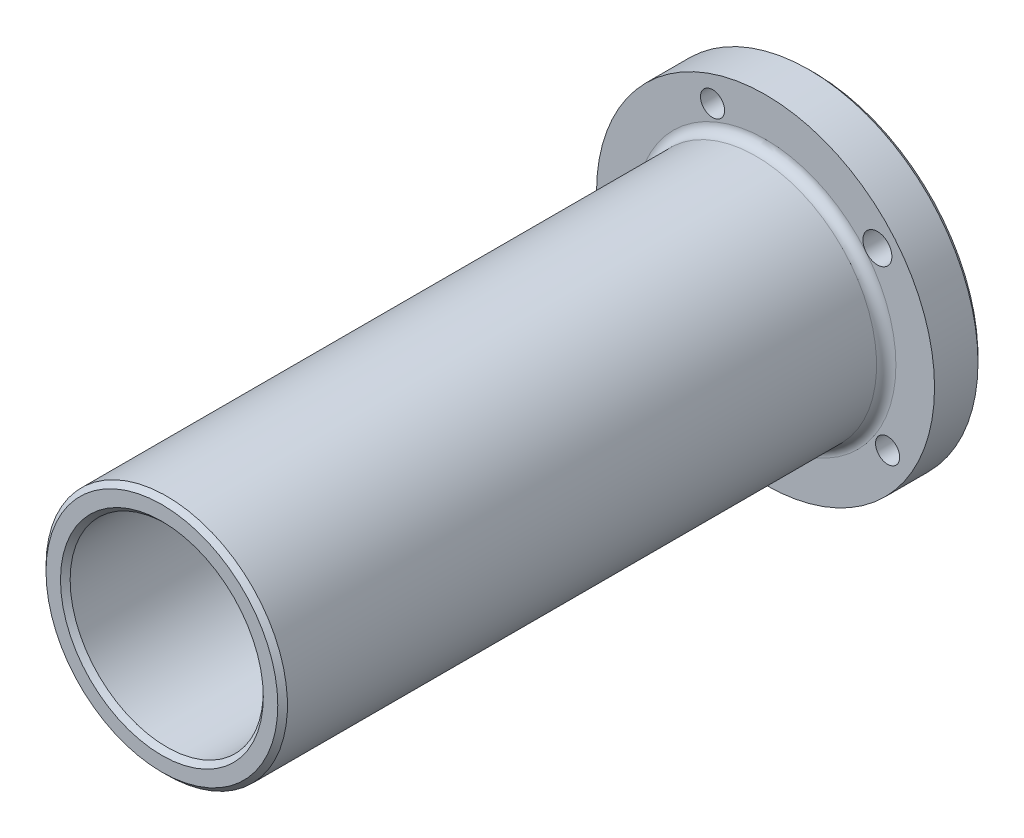
ISO-10303-21;
HEADER;
FILE_DESCRIPTION(('STEP AP214'),'2;1');
FILE_NAME('part.step','',(''),(''),'','','');
FILE_SCHEMA(('AUTOMOTIVE_DESIGN { 1 0 10303 214 1 1 1 1 }'));
ENDSEC;
DATA;
#1=APPLICATION_CONTEXT('core data for automotive mechanical design processes');
#2=APPLICATION_PROTOCOL_DEFINITION('international standard','automotive_design',2000,#1);
#3=PRODUCT_CONTEXT('',#1,'mechanical');
#4=PRODUCT('Part','Part','',(#3));
#5=PRODUCT_RELATED_PRODUCT_CATEGORY('part','',(#4));
#6=PRODUCT_DEFINITION_FORMATION('','',#4);
#7=PRODUCT_DEFINITION_CONTEXT('part definition',#1,'design');
#8=PRODUCT_DEFINITION('design','',#6,#7);
#9=PRODUCT_DEFINITION_SHAPE('','',#8);
#10=(LENGTH_UNIT() NAMED_UNIT(*) SI_UNIT(.MILLI.,.METRE.));
#11=(NAMED_UNIT(*) PLANE_ANGLE_UNIT() SI_UNIT($,.RADIAN.));
#12=(NAMED_UNIT(*) SI_UNIT($,.STERADIAN.) SOLID_ANGLE_UNIT());
#13=UNCERTAINTY_MEASURE_WITH_UNIT(LENGTH_MEASURE(1.E-05),#10,'distance_accuracy_value','');
#14=(GEOMETRIC_REPRESENTATION_CONTEXT(3) GLOBAL_UNCERTAINTY_ASSIGNED_CONTEXT((#13)) GLOBAL_UNIT_ASSIGNED_CONTEXT((#10,
#11,#12)) REPRESENTATION_CONTEXT('',''));
#15=CARTESIAN_POINT('',(0.,0.,0.));
#16=DIRECTION('',(0.,0.,1.));
#17=DIRECTION('',(1.,0.,0.));
#18=AXIS2_PLACEMENT_3D('',#15,#16,#17);
#19=CARTESIAN_POINT('',(70.,-1.10960886911009E-13,-135.));
#20=DIRECTION('',(0.,0.,1.));
#21=DIRECTION('',(1.,0.,0.));
#22=AXIS2_PLACEMENT_3D('',#19,#20,#21);
#23=CYLINDRICAL_SURFACE('',#22,25.);
#24=CARTESIAN_POINT('',(70.,-1.10960886911009E-13,-123.));
#25=DIRECTION('',(0.,0.,-1.));
#26=DIRECTION('',(-1.,0.,0.));
#27=AXIS2_PLACEMENT_3D('',#24,#25,#26);
#28=CIRCLE('',#27,25.);
#29=CARTESIAN_POINT('',(44.9999999999999,-1.10960886911009E-13,-123.));
#30=VERTEX_POINT('',#29);
#31=EDGE_CURVE('E50',#30,#30,#28,.F.);
#32=ORIENTED_EDGE('',*,*,#31,.T.);
#33=EDGE_LOOP('',(#32));
#34=FACE_BOUND('',#33,.T.);
#35=CARTESIAN_POINT('',(70.,-1.10960886911009E-13,-0.999999999999973));
#36=DIRECTION('',(0.,0.,-1.));
#37=DIRECTION('',(-1.,0.,0.));
#38=AXIS2_PLACEMENT_3D('',#35,#36,#37);
#39=CIRCLE('',#38,25.);
#40=CARTESIAN_POINT('',(44.9999999999999,-1.10960886911009E-13,-0.999999999999973));
#41=VERTEX_POINT('',#40);
#42=EDGE_CURVE('E85',#41,#41,#39,.T.);
#43=ORIENTED_EDGE('',*,*,#42,.T.);
#44=EDGE_LOOP('',(#43));
#45=FACE_BOUND('',#44,.T.);
#46=ADVANCED_FACE('F35',(#34,#45),#23,.T.);
#47=CARTESIAN_POINT('',(70.,-1.10960886911009E-13,0.));
#48=DIRECTION('',(0.,0.,-1.));
#49=DIRECTION('',(-1.,0.,0.));
#50=AXIS2_PLACEMENT_3D('',#47,#48,#49);
#51=PLANE('',#50);
#52=CARTESIAN_POINT('',(70.,-1.10960886911009E-13,0.));
#53=DIRECTION('',(0.,0.,-1.));
#54=DIRECTION('',(-1.,0.,0.));
#55=AXIS2_PLACEMENT_3D('',#52,#53,#54);
#56=CIRCLE('',#55,21.);
#57=CARTESIAN_POINT('',(48.9999999999999,-1.10960886911009E-13,0.));
#58=VERTEX_POINT('',#57);
#59=EDGE_CURVE('E54',#58,#58,#56,.T.);
#60=ORIENTED_EDGE('',*,*,#59,.T.);
#61=EDGE_LOOP('',(#60));
#62=FACE_BOUND('',#61,.T.);
#63=CARTESIAN_POINT('',(70.,-1.10960886911009E-13,0.));
#64=DIRECTION('',(0.,0.,-1.));
#65=DIRECTION('',(-1.,0.,0.));
#66=AXIS2_PLACEMENT_3D('',#63,#64,#65);
#67=CIRCLE('',#66,24.);
#68=CARTESIAN_POINT('',(45.9999999999999,-1.10960886911009E-13,0.));
#69=VERTEX_POINT('',#68);
#70=EDGE_CURVE('E83',#69,#69,#67,.F.);
#71=ORIENTED_EDGE('',*,*,#70,.T.);
#72=EDGE_LOOP('',(#71));
#73=FACE_BOUND('',#72,.T.);
#74=ADVANCED_FACE('F76',(#62,#73),#51,.F.);
#75=CARTESIAN_POINT('',(70.,-1.10960886911009E-13,-125.));
#76=DIRECTION('',(0.,0.,-1.));
#77=DIRECTION('',(-1.,0.,0.));
#78=AXIS2_PLACEMENT_3D('',#75,#76,#77);
#79=PLANE('',#78);
#80=CARTESIAN_POINT('',(93.168703387193,19.0581002032276,-125.));
#81=DIRECTION('',(0.,0.,-1.));
#82=DIRECTION('',(-1.,0.,0.));
#83=AXIS2_PLACEMENT_3D('',#80,#81,#82);
#84=CIRCLE('',#83,3.);
#85=CARTESIAN_POINT('',(90.8518330484737,17.1522901829048,-125.));
#86=VERTEX_POINT('',#85);
#87=EDGE_CURVE('E124',#86,#86,#84,.T.);
#88=ORIENTED_EDGE('',*,*,#87,.T.);
#89=CARTESIAN_POINT('',(70.,-1.10960886911009E-13,-125.));
#90=DIRECTION('',(0.,0.,-1.));
#91=DIRECTION('',(-1.,0.,0.));
#92=AXIS2_PLACEMENT_3D('',#89,#90,#91);
#93=CIRCLE('',#92,27.);
#94=EDGE_CURVE('E46',#86,#86,#93,.T.);
#95=ORIENTED_EDGE('',*,*,#94,.T.);
#96=EDGE_LOOP('',(#88,#95));
#97=FACE_BOUND('',#96,.T.);
#98=CARTESIAN_POINT('',(62.4581954582979,-29.0365491106429,-125.));
#99=DIRECTION('',(0.,0.,-1.));
#100=DIRECTION('',(-1.,0.,0.));
#101=AXIS2_PLACEMENT_3D('',#98,#99,#100);
#102=CIRCLE('',#101,2.5);
#103=CARTESIAN_POINT('',(59.9581954582979,-29.0365491106429,-125.));
#104=VERTEX_POINT('',#103);
#105=EDGE_CURVE('E118',#104,#104,#102,.T.);
#106=ORIENTED_EDGE('',*,*,#105,.T.);
#107=EDGE_LOOP('',(#106));
#108=FACE_BOUND('',#107,.T.);
#109=CARTESIAN_POINT('',(95.2848534707608,-16.1454694872017,-125.));
#110=DIRECTION('',(0.,0.,-1.));
#111=DIRECTION('',(-1.,0.,0.));
#112=AXIS2_PLACEMENT_3D('',#109,#110,#111);
#113=CIRCLE('',#112,2.5);
#114=CARTESIAN_POINT('',(92.7848534707608,-16.1454694872017,-125.));
#115=VERTEX_POINT('',#114);
#116=EDGE_CURVE('E112',#115,#115,#113,.T.);
#117=ORIENTED_EDGE('',*,*,#116,.T.);
#118=EDGE_LOOP('',(#117));
#119=FACE_BOUND('',#118,.T.);
#120=CARTESIAN_POINT('',(59.0341926977893,27.9240231737973,-125.));
#121=DIRECTION('',(0.,0.,-1.));
#122=DIRECTION('',(-1.,0.,0.));
#123=AXIS2_PLACEMENT_3D('',#120,#121,#122);
#124=CIRCLE('',#123,2.5);
#125=CARTESIAN_POINT('',(56.5341926977893,27.9240231737973,-125.));
#126=VERTEX_POINT('',#125);
#127=EDGE_CURVE('E106',#126,#126,#124,.T.);
#128=ORIENTED_EDGE('',*,*,#127,.T.);
#129=EDGE_LOOP('',(#128));
#130=FACE_BOUND('',#129,.T.);
#131=CARTESIAN_POINT('',(40.054054985959,-1.80010477918144,-125.));
#132=DIRECTION('',(0.,0.,-1.));
#133=DIRECTION('',(-1.,0.,0.));
#134=AXIS2_PLACEMENT_3D('',#131,#132,#133);
#135=CIRCLE('',#134,2.5);
#136=CARTESIAN_POINT('',(37.554054985959,-1.80010477918144,-125.));
#137=VERTEX_POINT('',#136);
#138=EDGE_CURVE('E100',#137,#137,#135,.T.);
#139=ORIENTED_EDGE('',*,*,#138,.T.);
#140=EDGE_LOOP('',(#139));
#141=FACE_BOUND('',#140,.T.);
#142=CARTESIAN_POINT('',(70.,-1.10960886911009E-13,-125.));
#143=DIRECTION('',(0.,0.,-1.));
#144=DIRECTION('',(-1.,0.,0.));
#145=AXIS2_PLACEMENT_3D('',#142,#143,#144);
#146=CIRCLE('',#145,35.);
#147=CARTESIAN_POINT('',(34.9999999999999,-1.10960886911009E-13,-125.));
#148=VERTEX_POINT('',#147);
#149=EDGE_CURVE('E97',#148,#148,#146,.T.);
#150=ORIENTED_EDGE('',*,*,#149,.F.);
#151=EDGE_LOOP('',(#150));
#152=FACE_BOUND('',#151,.T.);
#153=ADVANCED_FACE('F79',(#97,#108,#119,#130,#141,#152),#79,.F.);
#154=CARTESIAN_POINT('',(70.,-1.10960886911009E-13,-125.));
#155=DIRECTION('',(0.,0.,-1.));
#156=DIRECTION('',(-1.,0.,0.));
#157=AXIS2_PLACEMENT_3D('',#154,#155,#156);
#158=CYLINDRICAL_SURFACE('',#157,35.);
#159=CARTESIAN_POINT('',(70.,-1.10960886911009E-13,-134.));
#160=DIRECTION('',(0.,0.,-1.));
#161=DIRECTION('',(-1.,0.,0.));
#162=AXIS2_PLACEMENT_3D('',#159,#160,#161);
#163=CIRCLE('',#162,35.);
#164=CARTESIAN_POINT('',(34.9999999999999,-1.10960886911009E-13,-134.));
#165=VERTEX_POINT('',#164);
#166=EDGE_CURVE('E89',#165,#165,#163,.F.);
#167=ORIENTED_EDGE('',*,*,#166,.T.);
#168=EDGE_LOOP('',(#167));
#169=FACE_BOUND('',#168,.T.);
#170=ORIENTED_EDGE('',*,*,#149,.T.);
#171=EDGE_LOOP('',(#170));
#172=FACE_BOUND('',#171,.T.);
#173=ADVANCED_FACE('F194',(#169,#172),#158,.T.);
#174=CARTESIAN_POINT('',(70.,-1.10960886911009E-13,-135.));
#175=DIRECTION('',(0.,0.,-1.));
#176=DIRECTION('',(-1.,0.,0.));
#177=AXIS2_PLACEMENT_3D('',#174,#175,#176);
#178=PLANE('',#177);
#179=CARTESIAN_POINT('',(70.,-1.10960886911009E-13,-135.));
#180=DIRECTION('',(0.,0.,-1.));
#181=DIRECTION('',(-1.,0.,0.));
#182=AXIS2_PLACEMENT_3D('',#179,#180,#181);
#183=CIRCLE('',#182,21.);
#184=CARTESIAN_POINT('',(48.9999999999999,-1.10960886911009E-13,-135.));
#185=VERTEX_POINT('',#184);
#186=EDGE_CURVE('E11',#185,#185,#183,.F.);
#187=ORIENTED_EDGE('',*,*,#186,.T.);
#188=EDGE_LOOP('',(#187));
#189=FACE_BOUND('',#188,.T.);
#190=CARTESIAN_POINT('',(93.168703387193,19.0581002032276,-135.));
#191=DIRECTION('',(0.,0.,-1.));
#192=DIRECTION('',(-1.,0.,0.));
#193=AXIS2_PLACEMENT_3D('',#190,#191,#192);
#194=CIRCLE('',#193,3.50000000000003);
#195=CARTESIAN_POINT('',(89.6687033871929,19.0581002032276,-135.));
#196=VERTEX_POINT('',#195);
#197=EDGE_CURVE('E51',#196,#196,#194,.F.);
#198=ORIENTED_EDGE('',*,*,#197,.T.);
#199=EDGE_LOOP('',(#198));
#200=FACE_BOUND('',#199,.T.);
#201=CARTESIAN_POINT('',(62.4581954582979,-29.0365491106429,-135.));
#202=DIRECTION('',(0.,0.,-1.));
#203=DIRECTION('',(-1.,0.,0.));
#204=AXIS2_PLACEMENT_3D('',#201,#202,#203);
#205=CIRCLE('',#204,2.5);
#206=CARTESIAN_POINT('',(59.9581954582979,-29.0365491106429,-135.));
#207=VERTEX_POINT('',#206);
#208=EDGE_CURVE('E121',#207,#207,#205,.T.);
#209=ORIENTED_EDGE('',*,*,#208,.F.);
#210=EDGE_LOOP('',(#209));
#211=FACE_BOUND('',#210,.T.);
#212=CARTESIAN_POINT('',(95.2848534707608,-16.1454694872017,-135.));
#213=DIRECTION('',(0.,0.,-1.));
#214=DIRECTION('',(-1.,0.,0.));
#215=AXIS2_PLACEMENT_3D('',#212,#213,#214);
#216=CIRCLE('',#215,2.5);
#217=CARTESIAN_POINT('',(92.7848534707608,-16.1454694872017,-135.));
#218=VERTEX_POINT('',#217);
#219=EDGE_CURVE('E115',#218,#218,#216,.T.);
#220=ORIENTED_EDGE('',*,*,#219,.F.);
#221=EDGE_LOOP('',(#220));
#222=FACE_BOUND('',#221,.T.);
#223=CARTESIAN_POINT('',(59.0341926977893,27.9240231737973,-135.));
#224=DIRECTION('',(0.,0.,-1.));
#225=DIRECTION('',(-1.,0.,0.));
#226=AXIS2_PLACEMENT_3D('',#223,#224,#225);
#227=CIRCLE('',#226,2.5);
#228=CARTESIAN_POINT('',(56.5341926977893,27.9240231737973,-135.));
#229=VERTEX_POINT('',#228);
#230=EDGE_CURVE('E109',#229,#229,#227,.T.);
#231=ORIENTED_EDGE('',*,*,#230,.F.);
#232=EDGE_LOOP('',(#231));
#233=FACE_BOUND('',#232,.T.);
#234=CARTESIAN_POINT('',(40.054054985959,-1.80010477918144,-135.));
#235=DIRECTION('',(0.,0.,-1.));
#236=DIRECTION('',(-1.,0.,0.));
#237=AXIS2_PLACEMENT_3D('',#234,#235,#236);
#238=CIRCLE('',#237,2.5);
#239=CARTESIAN_POINT('',(37.554054985959,-1.80010477918144,-135.));
#240=VERTEX_POINT('',#239);
#241=EDGE_CURVE('E103',#240,#240,#238,.T.);
#242=ORIENTED_EDGE('',*,*,#241,.F.);
#243=EDGE_LOOP('',(#242));
#244=FACE_BOUND('',#243,.T.);
#245=CARTESIAN_POINT('',(70.,-1.10960886911009E-13,-135.));
#246=DIRECTION('',(0.,0.,-1.));
#247=DIRECTION('',(-1.,0.,0.));
#248=AXIS2_PLACEMENT_3D('',#245,#246,#247);
#249=CIRCLE('',#248,34.);
#250=CARTESIAN_POINT('',(36.,-1.10960886911009E-13,-135.));
#251=VERTEX_POINT('',#250);
#252=EDGE_CURVE('E94',#251,#251,#249,.T.);
#253=ORIENTED_EDGE('',*,*,#252,.T.);
#254=EDGE_LOOP('',(#253));
#255=FACE_BOUND('',#254,.T.);
#256=ADVANCED_FACE('F152',(#189,#200,#211,#222,#233,#244,#255),#178,.T.);
#257=CARTESIAN_POINT('',(70.,-1.10960886911009E-13,-135.));
#258=DIRECTION('',(0.,0.,1.));
#259=DIRECTION('',(1.,0.,0.));
#260=AXIS2_PLACEMENT_3D('',#257,#258,#259);
#261=CONICAL_SURFACE('',#260,34.,0.785398163397438);
#262=ORIENTED_EDGE('',*,*,#166,.F.);
#263=EDGE_LOOP('',(#262));
#264=FACE_BOUND('',#263,.T.);
#265=ORIENTED_EDGE('',*,*,#252,.F.);
#266=EDGE_LOOP('',(#265));
#267=FACE_BOUND('',#266,.T.);
#268=ADVANCED_FACE('F153',(#264,#267),#261,.T.);
#269=CARTESIAN_POINT('',(70.,-1.10960886911009E-13,-0.999999999999973));
#270=DIRECTION('',(0.,0.,-1.));
#271=DIRECTION('',(-1.,0.,0.));
#272=AXIS2_PLACEMENT_3D('',#269,#270,#271);
#273=CONICAL_SURFACE('',#272,25.,0.785398163397448);
#274=ORIENTED_EDGE('',*,*,#70,.F.);
#275=EDGE_LOOP('',(#274));
#276=FACE_BOUND('',#275,.T.);
#277=ORIENTED_EDGE('',*,*,#42,.F.);
#278=EDGE_LOOP('',(#277));
#279=FACE_BOUND('',#278,.T.);
#280=ADVANCED_FACE('F156',(#276,#279),#273,.T.);
#281=CARTESIAN_POINT('',(40.054054985959,-1.80010477918144,-135.));
#282=DIRECTION('',(0.,0.,-1.));
#283=DIRECTION('',(-1.,0.,0.));
#284=AXIS2_PLACEMENT_3D('',#281,#282,#283);
#285=CYLINDRICAL_SURFACE('',#284,2.5);
#286=ORIENTED_EDGE('',*,*,#241,.T.);
#287=EDGE_LOOP('',(#286));
#288=FACE_BOUND('',#287,.T.);
#289=ORIENTED_EDGE('',*,*,#138,.F.);
#290=EDGE_LOOP('',(#289));
#291=FACE_BOUND('',#290,.T.);
#292=ADVANCED_FACE('F159',(#288,#291),#285,.F.);
#293=CARTESIAN_POINT('',(59.0341926977893,27.9240231737973,-135.));
#294=DIRECTION('',(0.,0.,-1.));
#295=DIRECTION('',(-1.,0.,0.));
#296=AXIS2_PLACEMENT_3D('',#293,#294,#295);
#297=CYLINDRICAL_SURFACE('',#296,2.5);
#298=ORIENTED_EDGE('',*,*,#230,.T.);
#299=EDGE_LOOP('',(#298));
#300=FACE_BOUND('',#299,.T.);
#301=ORIENTED_EDGE('',*,*,#127,.F.);
#302=EDGE_LOOP('',(#301));
#303=FACE_BOUND('',#302,.T.);
#304=ADVANCED_FACE('F237',(#300,#303),#297,.F.);
#305=CARTESIAN_POINT('',(95.2848534707608,-16.1454694872017,-135.));
#306=DIRECTION('',(0.,0.,-1.));
#307=DIRECTION('',(-1.,0.,0.));
#308=AXIS2_PLACEMENT_3D('',#305,#306,#307);
#309=CYLINDRICAL_SURFACE('',#308,2.5);
#310=ORIENTED_EDGE('',*,*,#219,.T.);
#311=EDGE_LOOP('',(#310));
#312=FACE_BOUND('',#311,.T.);
#313=ORIENTED_EDGE('',*,*,#116,.F.);
#314=EDGE_LOOP('',(#313));
#315=FACE_BOUND('',#314,.T.);
#316=ADVANCED_FACE('F140',(#312,#315),#309,.F.);
#317=CARTESIAN_POINT('',(62.4581954582979,-29.0365491106429,-135.));
#318=DIRECTION('',(0.,0.,-1.));
#319=DIRECTION('',(-1.,0.,0.));
#320=AXIS2_PLACEMENT_3D('',#317,#318,#319);
#321=CYLINDRICAL_SURFACE('',#320,2.5);
#322=ORIENTED_EDGE('',*,*,#208,.T.);
#323=EDGE_LOOP('',(#322));
#324=FACE_BOUND('',#323,.T.);
#325=ORIENTED_EDGE('',*,*,#105,.F.);
#326=EDGE_LOOP('',(#325));
#327=FACE_BOUND('',#326,.T.);
#328=ADVANCED_FACE('F131',(#324,#327),#321,.F.);
#329=CARTESIAN_POINT('',(93.168703387193,19.0581002032276,-135.));
#330=DIRECTION('',(0.,0.,-1.));
#331=DIRECTION('',(-1.,0.,0.));
#332=AXIS2_PLACEMENT_3D('',#329,#330,#331);
#333=CYLINDRICAL_SURFACE('',#332,3.);
#334=CARTESIAN_POINT('',(93.168703387193,19.0581002032276,-134.5));
#335=DIRECTION('',(0.,0.,-1.));
#336=DIRECTION('',(-1.,0.,0.));
#337=AXIS2_PLACEMENT_3D('',#334,#335,#336);
#338=CIRCLE('',#337,3.);
#339=CARTESIAN_POINT('',(90.168703387193,19.0581002032276,-134.5));
#340=VERTEX_POINT('',#339);
#341=EDGE_CURVE('E57',#340,#340,#338,.T.);
#342=ORIENTED_EDGE('',*,*,#341,.T.);
#343=EDGE_LOOP('',(#342));
#344=FACE_BOUND('',#343,.T.);
#345=ORIENTED_EDGE('',*,*,#87,.F.);
#346=EDGE_LOOP('',(#345));
#347=FACE_BOUND('',#346,.T.);
#348=ADVANCED_FACE('F128',(#344,#347),#333,.F.);
#349=CARTESIAN_POINT('',(93.168703387193,19.0581002032276,-134.5));
#350=DIRECTION('',(0.,0.,-1.));
#351=DIRECTION('',(-1.,0.,0.));
#352=AXIS2_PLACEMENT_3D('',#349,#350,#351);
#353=CONICAL_SURFACE('',#352,3.,0.785398163397455);
#354=ORIENTED_EDGE('',*,*,#197,.F.);
#355=EDGE_LOOP('',(#354));
#356=FACE_BOUND('',#355,.T.);
#357=ORIENTED_EDGE('',*,*,#341,.F.);
#358=EDGE_LOOP('',(#357));
#359=FACE_BOUND('',#358,.T.);
#360=ADVANCED_FACE('F130',(#356,#359),#353,.F.);
#361=CARTESIAN_POINT('',(70.,-1.10960886911009E-13,0.));
#362=DIRECTION('',(0.,0.,-1.));
#363=DIRECTION('',(-1.,0.,0.));
#364=AXIS2_PLACEMENT_3D('',#361,#362,#363);
#365=CYLINDRICAL_SURFACE('',#364,20.);
#366=CARTESIAN_POINT('',(70.,-1.10960886911009E-13,-1.00000000000002));
#367=DIRECTION('',(0.,0.,-1.));
#368=DIRECTION('',(-1.,0.,0.));
#369=AXIS2_PLACEMENT_3D('',#366,#367,#368);
#370=CIRCLE('',#369,20.);
#371=CARTESIAN_POINT('',(50.,-1.10960886911009E-13,-1.00000000000002));
#372=VERTEX_POINT('',#371);
#373=EDGE_CURVE('E42',#372,#372,#370,.F.);
#374=ORIENTED_EDGE('',*,*,#373,.T.);
#375=EDGE_LOOP('',(#374));
#376=FACE_BOUND('',#375,.T.);
#377=CARTESIAN_POINT('',(70.,-1.10960886911009E-13,-134.));
#378=DIRECTION('',(0.,0.,-1.));
#379=DIRECTION('',(-1.,0.,0.));
#380=AXIS2_PLACEMENT_3D('',#377,#378,#379);
#381=CIRCLE('',#380,20.);
#382=CARTESIAN_POINT('',(50.,-1.10960886911009E-13,-134.));
#383=VERTEX_POINT('',#382);
#384=EDGE_CURVE('E63',#383,#383,#381,.T.);
#385=ORIENTED_EDGE('',*,*,#384,.T.);
#386=EDGE_LOOP('',(#385));
#387=FACE_BOUND('',#386,.T.);
#388=ADVANCED_FACE('F68',(#376,#387),#365,.F.);
#389=CARTESIAN_POINT('',(70.,-1.10960886911009E-13,-123.));
#390=DIRECTION('',(0.,0.,-1.));
#391=DIRECTION('',(-1.,0.,0.));
#392=AXIS2_PLACEMENT_3D('',#389,#390,#391);
#393=TOROIDAL_SURFACE('',#392,27.,2.);
#394=ORIENTED_EDGE('',*,*,#31,.F.);
#395=EDGE_LOOP('',(#394));
#396=FACE_BOUND('',#395,.T.);
#397=ORIENTED_EDGE('',*,*,#94,.F.);
#398=EDGE_LOOP('',(#397));
#399=FACE_BOUND('',#398,.T.);
#400=ADVANCED_FACE('F47',(#396,#399),#393,.F.);
#401=CARTESIAN_POINT('',(70.,-1.10960886911009E-13,0.));
#402=DIRECTION('',(0.,0.,1.));
#403=DIRECTION('',(1.,0.,0.));
#404=AXIS2_PLACEMENT_3D('',#401,#402,#403);
#405=CONICAL_SURFACE('',#404,21.,0.785398163397448);
#406=ORIENTED_EDGE('',*,*,#373,.F.);
#407=EDGE_LOOP('',(#406));
#408=FACE_BOUND('',#407,.T.);
#409=ORIENTED_EDGE('',*,*,#59,.F.);
#410=EDGE_LOOP('',(#409));
#411=FACE_BOUND('',#410,.T.);
#412=ADVANCED_FACE('F71',(#408,#411),#405,.F.);
#413=CARTESIAN_POINT('',(70.,-1.10960886911009E-13,-134.));
#414=DIRECTION('',(0.,0.,-1.));
#415=DIRECTION('',(-1.,0.,0.));
#416=AXIS2_PLACEMENT_3D('',#413,#414,#415);
#417=CONICAL_SURFACE('',#416,20.,0.78539816339745);
#418=ORIENTED_EDGE('',*,*,#186,.F.);
#419=EDGE_LOOP('',(#418));
#420=FACE_BOUND('',#419,.T.);
#421=ORIENTED_EDGE('',*,*,#384,.F.);
#422=EDGE_LOOP('',(#421));
#423=FACE_BOUND('',#422,.T.);
#424=ADVANCED_FACE('F37',(#420,#423),#417,.F.);
#425=CLOSED_SHELL('',(#46,#74,#153,#173,#256,#268,#280,#292,#304,#316,#328,#348,#360,#388,#400,
#412,#424));
#426=MANIFOLD_SOLID_BREP('B2',#425);
#427=ADVANCED_BREP_SHAPE_REPRESENTATION('',(#18,#426),#14);
#428=SHAPE_DEFINITION_REPRESENTATION(#9,#427);
ENDSEC;
END-ISO-10303-21;
